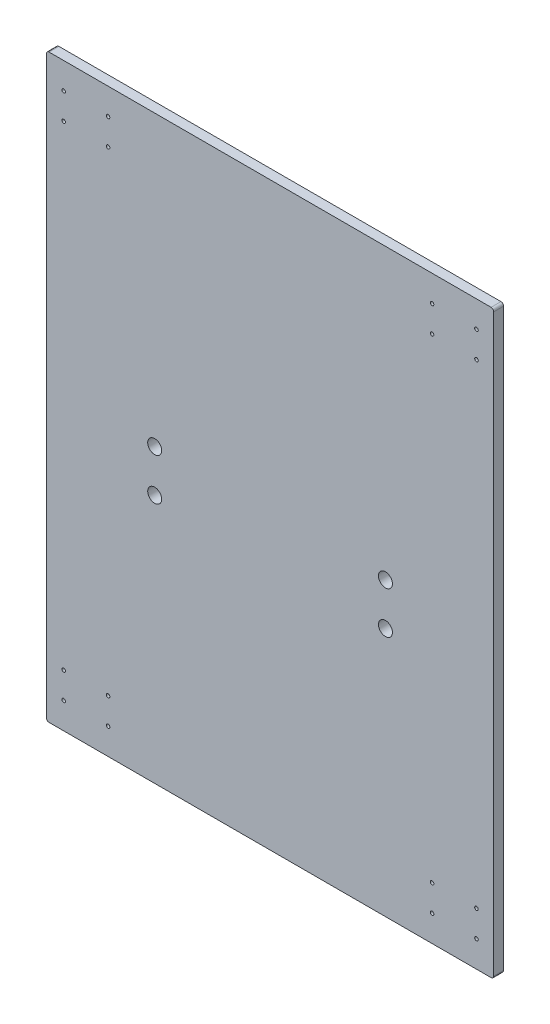
ISO-10303-21;
HEADER;
FILE_DESCRIPTION(('STEP AP214'),'2;1');
FILE_NAME('part.step','',(''),(''),'','','');
FILE_SCHEMA(('AUTOMOTIVE_DESIGN { 1 0 10303 214 1 1 1 1 }'));
ENDSEC;
DATA;
#1=APPLICATION_CONTEXT('core data for automotive mechanical design processes');
#2=APPLICATION_PROTOCOL_DEFINITION('international standard','automotive_design',2000,#1);
#3=PRODUCT_CONTEXT('',#1,'mechanical');
#4=PRODUCT('Part','Part','',(#3));
#5=PRODUCT_RELATED_PRODUCT_CATEGORY('part','',(#4));
#6=PRODUCT_DEFINITION_FORMATION('','',#4);
#7=PRODUCT_DEFINITION_CONTEXT('part definition',#1,'design');
#8=PRODUCT_DEFINITION('design','',#6,#7);
#9=PRODUCT_DEFINITION_SHAPE('','',#8);
#10=(LENGTH_UNIT() NAMED_UNIT(*) SI_UNIT(.MILLI.,.METRE.));
#11=(NAMED_UNIT(*) PLANE_ANGLE_UNIT() SI_UNIT($,.RADIAN.));
#12=(NAMED_UNIT(*) SI_UNIT($,.STERADIAN.) SOLID_ANGLE_UNIT());
#13=UNCERTAINTY_MEASURE_WITH_UNIT(LENGTH_MEASURE(1.E-05),#10,'distance_accuracy_value','');
#14=(GEOMETRIC_REPRESENTATION_CONTEXT(3) GLOBAL_UNCERTAINTY_ASSIGNED_CONTEXT((#13)) GLOBAL_UNIT_ASSIGNED_CONTEXT((#10,
#11,#12)) REPRESENTATION_CONTEXT('',''));
#15=CARTESIAN_POINT('',(0.,0.,0.));
#16=DIRECTION('',(0.,0.,1.));
#17=DIRECTION('',(1.,0.,0.));
#18=AXIS2_PLACEMENT_3D('',#15,#16,#17);
#19=CARTESIAN_POINT('',(0.,0.,0.));
#20=DIRECTION('',(0.,0.,1.));
#21=DIRECTION('',(1.,0.,0.));
#22=AXIS2_PLACEMENT_3D('',#19,#20,#21);
#23=PLANE('',#22);
#24=CARTESIAN_POINT('',(334.162399999999,-496.8875,0.));
#25=DIRECTION('',(0.,0.,-1.));
#26=DIRECTION('',(-1.,0.,0.));
#27=AXIS2_PLACEMENT_3D('',#24,#25,#26);
#28=CIRCLE('',#27,1.72719999999998);
#29=CARTESIAN_POINT('',(332.435199999999,-496.8875,0.));
#30=VERTEX_POINT('',#29);
#31=EDGE_CURVE('E217',#30,#30,#28,.T.);
#32=ORIENTED_EDGE('',*,*,#31,.F.);
#33=EDGE_LOOP('',(#32));
#34=FACE_BOUND('',#33,.T.);
#35=CARTESIAN_POINT('',(289.17138,-240.74374,0.));
#36=DIRECTION('',(0.,0.,-1.));
#37=DIRECTION('',(-1.,0.,0.));
#38=AXIS2_PLACEMENT_3D('',#35,#36,#37);
#39=CIRCLE('',#38,6.74624000000001);
#40=CARTESIAN_POINT('',(282.42514,-240.74374,0.));
#41=VERTEX_POINT('',#40);
#42=EDGE_CURVE('E199',#41,#41,#39,.T.);
#43=ORIENTED_EDGE('',*,*,#42,.F.);
#44=EDGE_LOOP('',(#43));
#45=FACE_BOUND('',#44,.T.);
#46=CARTESIAN_POINT('',(289.17138,-281.38374,0.));
#47=DIRECTION('',(0.,0.,-1.));
#48=DIRECTION('',(-1.,0.,0.));
#49=AXIS2_PLACEMENT_3D('',#46,#47,#48);
#50=CIRCLE('',#49,6.74624000000001);
#51=CARTESIAN_POINT('',(282.42514,-281.38374,0.));
#52=VERTEX_POINT('',#51);
#53=EDGE_CURVE('E193',#52,#52,#50,.T.);
#54=ORIENTED_EDGE('',*,*,#53,.F.);
#55=EDGE_LOOP('',(#54));
#56=FACE_BOUND('',#55,.T.);
#57=CARTESIAN_POINT('',(66.4286199999998,-240.74374,0.));
#58=DIRECTION('',(0.,0.,-1.));
#59=DIRECTION('',(-1.,0.,0.));
#60=AXIS2_PLACEMENT_3D('',#57,#58,#59);
#61=CIRCLE('',#60,6.74624);
#62=CARTESIAN_POINT('',(59.6823799999998,-240.74374,0.));
#63=VERTEX_POINT('',#62);
#64=EDGE_CURVE('E174',#63,#63,#61,.T.);
#65=ORIENTED_EDGE('',*,*,#64,.F.);
#66=EDGE_LOOP('',(#65));
#67=FACE_BOUND('',#66,.T.);
#68=DIRECTION('',(-1.,0.,0.));
#69=VECTOR('',#68,1.);
#70=CARTESIAN_POINT('',(393.699999999999,38.1,0.));
#71=LINE('',#70,#69);
#72=CARTESIAN_POINT('',(391.159999999999,38.1,0.));
#73=VERTEX_POINT('',#72);
#74=CARTESIAN_POINT('',(-35.56,38.1,0.));
#75=VERTEX_POINT('',#74);
#76=EDGE_CURVE('E124',#73,#75,#71,.T.);
#77=ORIENTED_EDGE('',*,*,#76,.F.);
#78=CARTESIAN_POINT('',(391.159999999999,35.56,0.));
#79=DIRECTION('',(0.,0.,1.));
#80=DIRECTION('',(1.,0.,0.));
#81=AXIS2_PLACEMENT_3D('',#78,#79,#80);
#82=CIRCLE('',#81,2.54);
#83=CARTESIAN_POINT('',(393.699999999999,35.56,0.));
#84=VERTEX_POINT('',#83);
#85=EDGE_CURVE('E107',#73,#84,#82,.F.);
#86=ORIENTED_EDGE('',*,*,#85,.T.);
#87=DIRECTION('',(0.,1.,0.));
#88=VECTOR('',#87,1.);
#89=CARTESIAN_POINT('',(393.699999999999,-522.2875,0.));
#90=LINE('',#89,#88);
#91=CARTESIAN_POINT('',(393.699999999999,-519.7475,0.));
#92=VERTEX_POINT('',#91);
#93=EDGE_CURVE('E134',#92,#84,#90,.T.);
#94=ORIENTED_EDGE('',*,*,#93,.F.);
#95=CARTESIAN_POINT('',(391.159999999999,-519.7475,0.));
#96=DIRECTION('',(0.,0.,1.));
#97=DIRECTION('',(1.,0.,0.));
#98=AXIS2_PLACEMENT_3D('',#95,#96,#97);
#99=CIRCLE('',#98,2.54);
#100=CARTESIAN_POINT('',(391.159999999999,-522.2875,0.));
#101=VERTEX_POINT('',#100);
#102=EDGE_CURVE('E118',#92,#101,#99,.F.);
#103=ORIENTED_EDGE('',*,*,#102,.T.);
#104=DIRECTION('',(1.,0.,0.));
#105=VECTOR('',#104,1.);
#106=CARTESIAN_POINT('',(393.699999999999,-522.2875,0.));
#107=LINE('',#106,#105);
#108=CARTESIAN_POINT('',(-35.56,-522.2875,0.));
#109=VERTEX_POINT('',#108);
#110=EDGE_CURVE('E138',#109,#101,#107,.T.);
#111=ORIENTED_EDGE('',*,*,#110,.F.);
#112=CARTESIAN_POINT('',(-35.56,-519.7475,0.));
#113=DIRECTION('',(0.,0.,1.));
#114=DIRECTION('',(1.,0.,0.));
#115=AXIS2_PLACEMENT_3D('',#112,#113,#114);
#116=CIRCLE('',#115,2.54);
#117=CARTESIAN_POINT('',(-38.1,-519.7475,0.));
#118=VERTEX_POINT('',#117);
#119=EDGE_CURVE('E144',#109,#118,#116,.F.);
#120=ORIENTED_EDGE('',*,*,#119,.T.);
#121=DIRECTION('',(0.,-1.,0.));
#122=VECTOR('',#121,1.);
#123=CARTESIAN_POINT('',(-38.1,-522.2875,0.));
#124=LINE('',#123,#122);
#125=CARTESIAN_POINT('',(-38.1,35.5599999999999,0.));
#126=VERTEX_POINT('',#125);
#127=EDGE_CURVE('E166',#126,#118,#124,.T.);
#128=ORIENTED_EDGE('',*,*,#127,.F.);
#129=CARTESIAN_POINT('',(-35.56,35.5599999999999,0.));
#130=DIRECTION('',(0.,0.,1.));
#131=DIRECTION('',(1.,0.,0.));
#132=AXIS2_PLACEMENT_3D('',#129,#130,#131);
#133=CIRCLE('',#132,2.54);
#134=EDGE_CURVE('E128',#126,#75,#133,.F.);
#135=ORIENTED_EDGE('',*,*,#134,.T.);
#136=EDGE_LOOP('',(#77,#86,#94,#103,#111,#120,#128,#135));
#137=FACE_BOUND('',#136,.T.);
#138=CARTESIAN_POINT('',(66.4286199999997,-281.38374,0.));
#139=DIRECTION('',(0.,0.,-1.));
#140=DIRECTION('',(-1.,0.,0.));
#141=AXIS2_PLACEMENT_3D('',#138,#139,#140);
#142=CIRCLE('',#141,6.74624);
#143=CARTESIAN_POINT('',(59.6823799999997,-281.38374,0.));
#144=VERTEX_POINT('',#143);
#145=EDGE_CURVE('E187',#144,#144,#142,.T.);
#146=ORIENTED_EDGE('',*,*,#145,.F.);
#147=EDGE_LOOP('',(#146));
#148=FACE_BOUND('',#147,.T.);
#149=CARTESIAN_POINT('',(377.037599999999,-496.8875,0.));
#150=DIRECTION('',(0.,0.,-1.));
#151=DIRECTION('',(-1.,0.,0.));
#152=AXIS2_PLACEMENT_3D('',#149,#150,#151);
#153=CIRCLE('',#152,1.72719999999998);
#154=CARTESIAN_POINT('',(375.310399999999,-496.8875,0.));
#155=VERTEX_POINT('',#154);
#156=EDGE_CURVE('E205',#155,#155,#153,.T.);
#157=ORIENTED_EDGE('',*,*,#156,.F.);
#158=EDGE_LOOP('',(#157));
#159=FACE_BOUND('',#158,.T.);
#160=CARTESIAN_POINT('',(377.037599999999,-471.4875,0.));
#161=DIRECTION('',(0.,0.,-1.));
#162=DIRECTION('',(-1.,0.,0.));
#163=AXIS2_PLACEMENT_3D('',#160,#161,#162);
#164=CIRCLE('',#163,1.72719999999998);
#165=CARTESIAN_POINT('',(375.310399999999,-471.4875,0.));
#166=VERTEX_POINT('',#165);
#167=EDGE_CURVE('E211',#166,#166,#164,.T.);
#168=ORIENTED_EDGE('',*,*,#167,.F.);
#169=EDGE_LOOP('',(#168));
#170=FACE_BOUND('',#169,.T.);
#171=CARTESIAN_POINT('',(334.162399999999,-471.4875,0.));
#172=DIRECTION('',(0.,0.,-1.));
#173=DIRECTION('',(-1.,0.,0.));
#174=AXIS2_PLACEMENT_3D('',#171,#172,#173);
#175=CIRCLE('',#174,1.72719999999998);
#176=CARTESIAN_POINT('',(332.435199999999,-471.4875,0.));
#177=VERTEX_POINT('',#176);
#178=EDGE_CURVE('E223',#177,#177,#175,.T.);
#179=ORIENTED_EDGE('',*,*,#178,.F.);
#180=EDGE_LOOP('',(#179));
#181=FACE_BOUND('',#180,.T.);
#182=CARTESIAN_POINT('',(21.4376000000001,-471.4875,0.));
#183=DIRECTION('',(0.,0.,-1.));
#184=DIRECTION('',(-1.,0.,0.));
#185=AXIS2_PLACEMENT_3D('',#182,#183,#184);
#186=CIRCLE('',#185,1.7272);
#187=CARTESIAN_POINT('',(19.7104000000001,-471.4875,0.));
#188=VERTEX_POINT('',#187);
#189=EDGE_CURVE('E229',#188,#188,#186,.T.);
#190=ORIENTED_EDGE('',*,*,#189,.F.);
#191=EDGE_LOOP('',(#190));
#192=FACE_BOUND('',#191,.T.);
#193=CARTESIAN_POINT('',(-21.4375999999999,-471.4875,0.));
#194=DIRECTION('',(0.,0.,-1.));
#195=DIRECTION('',(-1.,0.,0.));
#196=AXIS2_PLACEMENT_3D('',#193,#194,#195);
#197=CIRCLE('',#196,1.7272);
#198=CARTESIAN_POINT('',(-23.1647999999999,-471.4875,0.));
#199=VERTEX_POINT('',#198);
#200=EDGE_CURVE('E235',#199,#199,#197,.T.);
#201=ORIENTED_EDGE('',*,*,#200,.F.);
#202=EDGE_LOOP('',(#201));
#203=FACE_BOUND('',#202,.T.);
#204=CARTESIAN_POINT('',(-21.4376,-496.8875,0.));
#205=DIRECTION('',(0.,0.,-1.));
#206=DIRECTION('',(-1.,0.,0.));
#207=AXIS2_PLACEMENT_3D('',#204,#205,#206);
#208=CIRCLE('',#207,1.7272);
#209=CARTESIAN_POINT('',(-23.1647999999999,-496.8875,0.));
#210=VERTEX_POINT('',#209);
#211=EDGE_CURVE('E241',#210,#210,#208,.T.);
#212=ORIENTED_EDGE('',*,*,#211,.F.);
#213=EDGE_LOOP('',(#212));
#214=FACE_BOUND('',#213,.T.);
#215=CARTESIAN_POINT('',(21.4376,-496.8875,0.));
#216=DIRECTION('',(0.,0.,-1.));
#217=DIRECTION('',(-1.,0.,0.));
#218=AXIS2_PLACEMENT_3D('',#215,#216,#217);
#219=CIRCLE('',#218,1.7272);
#220=CARTESIAN_POINT('',(19.7104000000001,-496.8875,0.));
#221=VERTEX_POINT('',#220);
#222=EDGE_CURVE('E247',#221,#221,#219,.T.);
#223=ORIENTED_EDGE('',*,*,#222,.F.);
#224=EDGE_LOOP('',(#223));
#225=FACE_BOUND('',#224,.T.);
#226=CARTESIAN_POINT('',(21.4376000000001,12.7,0.));
#227=DIRECTION('',(0.,0.,-1.));
#228=DIRECTION('',(-1.,0.,0.));
#229=AXIS2_PLACEMENT_3D('',#226,#227,#228);
#230=CIRCLE('',#229,1.7272);
#231=CARTESIAN_POINT('',(19.7104000000001,12.7,0.));
#232=VERTEX_POINT('',#231);
#233=EDGE_CURVE('E253',#232,#232,#230,.T.);
#234=ORIENTED_EDGE('',*,*,#233,.F.);
#235=EDGE_LOOP('',(#234));
#236=FACE_BOUND('',#235,.T.);
#237=CARTESIAN_POINT('',(-21.4375999999999,12.7,0.));
#238=DIRECTION('',(0.,0.,-1.));
#239=DIRECTION('',(-1.,0.,0.));
#240=AXIS2_PLACEMENT_3D('',#237,#238,#239);
#241=CIRCLE('',#240,1.7272);
#242=CARTESIAN_POINT('',(-23.1647999999999,12.7,0.));
#243=VERTEX_POINT('',#242);
#244=EDGE_CURVE('E259',#243,#243,#241,.T.);
#245=ORIENTED_EDGE('',*,*,#244,.F.);
#246=EDGE_LOOP('',(#245));
#247=FACE_BOUND('',#246,.T.);
#248=CARTESIAN_POINT('',(-21.4375999999999,-12.7,0.));
#249=DIRECTION('',(0.,0.,-1.));
#250=DIRECTION('',(-1.,0.,0.));
#251=AXIS2_PLACEMENT_3D('',#248,#249,#250);
#252=CIRCLE('',#251,1.7272);
#253=CARTESIAN_POINT('',(-23.1647999999999,-12.7,0.));
#254=VERTEX_POINT('',#253);
#255=EDGE_CURVE('E265',#254,#254,#252,.T.);
#256=ORIENTED_EDGE('',*,*,#255,.F.);
#257=EDGE_LOOP('',(#256));
#258=FACE_BOUND('',#257,.T.);
#259=CARTESIAN_POINT('',(21.4376000000001,-12.7,0.));
#260=DIRECTION('',(0.,0.,-1.));
#261=DIRECTION('',(-1.,0.,0.));
#262=AXIS2_PLACEMENT_3D('',#259,#260,#261);
#263=CIRCLE('',#262,1.7272);
#264=CARTESIAN_POINT('',(19.7104000000001,-12.7,0.));
#265=VERTEX_POINT('',#264);
#266=EDGE_CURVE('E271',#265,#265,#263,.T.);
#267=ORIENTED_EDGE('',*,*,#266,.F.);
#268=EDGE_LOOP('',(#267));
#269=FACE_BOUND('',#268,.T.);
#270=CARTESIAN_POINT('',(334.162399999999,-12.7,0.));
#271=DIRECTION('',(0.,0.,-1.));
#272=DIRECTION('',(-1.,0.,0.));
#273=AXIS2_PLACEMENT_3D('',#270,#271,#272);
#274=CIRCLE('',#273,1.72719999999998);
#275=CARTESIAN_POINT('',(332.435199999999,-12.7,0.));
#276=VERTEX_POINT('',#275);
#277=EDGE_CURVE('E277',#276,#276,#274,.T.);
#278=ORIENTED_EDGE('',*,*,#277,.F.);
#279=EDGE_LOOP('',(#278));
#280=FACE_BOUND('',#279,.T.);
#281=CARTESIAN_POINT('',(334.162399999999,12.7,0.));
#282=DIRECTION('',(0.,0.,-1.));
#283=DIRECTION('',(-1.,0.,0.));
#284=AXIS2_PLACEMENT_3D('',#281,#282,#283);
#285=CIRCLE('',#284,1.72719999999998);
#286=CARTESIAN_POINT('',(332.435199999999,12.7,0.));
#287=VERTEX_POINT('',#286);
#288=EDGE_CURVE('E283',#287,#287,#285,.T.);
#289=ORIENTED_EDGE('',*,*,#288,.F.);
#290=EDGE_LOOP('',(#289));
#291=FACE_BOUND('',#290,.T.);
#292=CARTESIAN_POINT('',(377.037599999999,-12.7,0.));
#293=DIRECTION('',(0.,0.,-1.));
#294=DIRECTION('',(-1.,0.,0.));
#295=AXIS2_PLACEMENT_3D('',#292,#293,#294);
#296=CIRCLE('',#295,1.72719999999998);
#297=CARTESIAN_POINT('',(375.310399999999,-12.7,0.));
#298=VERTEX_POINT('',#297);
#299=EDGE_CURVE('E289',#298,#298,#296,.T.);
#300=ORIENTED_EDGE('',*,*,#299,.F.);
#301=EDGE_LOOP('',(#300));
#302=FACE_BOUND('',#301,.T.);
#303=CARTESIAN_POINT('',(377.037599999999,12.7,0.));
#304=DIRECTION('',(0.,0.,-1.));
#305=DIRECTION('',(-1.,0.,0.));
#306=AXIS2_PLACEMENT_3D('',#303,#304,#305);
#307=CIRCLE('',#306,1.72719999999998);
#308=CARTESIAN_POINT('',(375.310399999999,12.7,0.));
#309=VERTEX_POINT('',#308);
#310=EDGE_CURVE('E295',#309,#309,#307,.T.);
#311=ORIENTED_EDGE('',*,*,#310,.F.);
#312=EDGE_LOOP('',(#311));
#313=FACE_BOUND('',#312,.T.);
#314=ADVANCED_FACE('F41',(#34,#45,#56,#67,#137,#148,#159,#170,#181,#192,#203,#214,#225,#236,
#247,#258,#269,#280,#291,#302,#313),#23,.F.);
#315=CARTESIAN_POINT('',(-38.1,-522.2875,9.525));
#316=DIRECTION('',(1.,0.,0.));
#317=DIRECTION('',(0.,0.,-1.));
#318=AXIS2_PLACEMENT_3D('',#315,#316,#317);
#319=PLANE('',#318);
#320=ORIENTED_EDGE('',*,*,#127,.T.);
#321=DIRECTION('',(0.,0.,-1.));
#322=VECTOR('',#321,1.);
#323=CARTESIAN_POINT('',(-38.1,-519.7475,9.525));
#324=LINE('',#323,#322);
#325=CARTESIAN_POINT('',(-38.1,-519.7475,9.525));
#326=VERTEX_POINT('',#325);
#327=EDGE_CURVE('E11',#118,#326,#324,.F.);
#328=ORIENTED_EDGE('',*,*,#327,.T.);
#329=DIRECTION('',(0.,-1.,0.));
#330=VECTOR('',#329,1.);
#331=CARTESIAN_POINT('',(-38.1,-522.2875,9.525));
#332=LINE('',#331,#330);
#333=CARTESIAN_POINT('',(-38.1,35.5599999999999,9.525));
#334=VERTEX_POINT('',#333);
#335=EDGE_CURVE('E133',#334,#326,#332,.T.);
#336=ORIENTED_EDGE('',*,*,#335,.F.);
#337=DIRECTION('',(0.,0.,-1.));
#338=VECTOR('',#337,1.);
#339=CARTESIAN_POINT('',(-38.1,35.5599999999999,9.525));
#340=LINE('',#339,#338);
#341=EDGE_CURVE('E49',#334,#126,#340,.T.);
#342=ORIENTED_EDGE('',*,*,#341,.T.);
#343=EDGE_LOOP('',(#320,#328,#336,#342));
#344=FACE_BOUND('',#343,.T.);
#345=ADVANCED_FACE('F165',(#344),#319,.F.);
#346=CARTESIAN_POINT('',(393.699999999999,-522.2875,9.525));
#347=DIRECTION('',(0.,1.,0.));
#348=DIRECTION('',(0.,0.,1.));
#349=AXIS2_PLACEMENT_3D('',#346,#347,#348);
#350=PLANE('',#349);
#351=ORIENTED_EDGE('',*,*,#110,.T.);
#352=DIRECTION('',(0.,0.,-1.));
#353=VECTOR('',#352,1.);
#354=CARTESIAN_POINT('',(391.159999999999,-522.2875,9.525));
#355=LINE('',#354,#353);
#356=CARTESIAN_POINT('',(391.159999999999,-522.2875,9.525));
#357=VERTEX_POINT('',#356);
#358=EDGE_CURVE('E56',#101,#357,#355,.F.);
#359=ORIENTED_EDGE('',*,*,#358,.T.);
#360=DIRECTION('',(1.,0.,0.));
#361=VECTOR('',#360,1.);
#362=CARTESIAN_POINT('',(393.699999999999,-522.2875,9.525));
#363=LINE('',#362,#361);
#364=CARTESIAN_POINT('',(-35.56,-522.2875,9.525));
#365=VERTEX_POINT('',#364);
#366=EDGE_CURVE('E136',#365,#357,#363,.T.);
#367=ORIENTED_EDGE('',*,*,#366,.F.);
#368=DIRECTION('',(0.,0.,-1.));
#369=VECTOR('',#368,1.);
#370=CARTESIAN_POINT('',(-35.56,-522.2875,9.525));
#371=LINE('',#370,#369);
#372=EDGE_CURVE('E157',#365,#109,#371,.T.);
#373=ORIENTED_EDGE('',*,*,#372,.T.);
#374=EDGE_LOOP('',(#351,#359,#367,#373));
#375=FACE_BOUND('',#374,.T.);
#376=ADVANCED_FACE('F310',(#375),#350,.F.);
#377=CARTESIAN_POINT('',(393.699999999999,-522.2875,9.525));
#378=DIRECTION('',(-1.,0.,0.));
#379=DIRECTION('',(0.,0.,1.));
#380=AXIS2_PLACEMENT_3D('',#377,#378,#379);
#381=PLANE('',#380);
#382=ORIENTED_EDGE('',*,*,#93,.T.);
#383=DIRECTION('',(0.,0.,-1.));
#384=VECTOR('',#383,1.);
#385=CARTESIAN_POINT('',(393.699999999999,35.56,9.525));
#386=LINE('',#385,#384);
#387=CARTESIAN_POINT('',(393.699999999999,35.56,9.525));
#388=VERTEX_POINT('',#387);
#389=EDGE_CURVE('E112',#84,#388,#386,.F.);
#390=ORIENTED_EDGE('',*,*,#389,.T.);
#391=DIRECTION('',(0.,1.,0.));
#392=VECTOR('',#391,1.);
#393=CARTESIAN_POINT('',(393.699999999999,-522.2875,9.525));
#394=LINE('',#393,#392);
#395=CARTESIAN_POINT('',(393.699999999999,-519.7475,9.525));
#396=VERTEX_POINT('',#395);
#397=EDGE_CURVE('E178',#396,#388,#394,.T.);
#398=ORIENTED_EDGE('',*,*,#397,.F.);
#399=DIRECTION('',(0.,0.,-1.));
#400=VECTOR('',#399,1.);
#401=CARTESIAN_POINT('',(393.699999999999,-519.7475,9.525));
#402=LINE('',#401,#400);
#403=EDGE_CURVE('E117',#396,#92,#402,.T.);
#404=ORIENTED_EDGE('',*,*,#403,.T.);
#405=EDGE_LOOP('',(#382,#390,#398,#404));
#406=FACE_BOUND('',#405,.T.);
#407=ADVANCED_FACE('F320',(#406),#381,.F.);
#408=CARTESIAN_POINT('',(393.699999999999,38.1,9.525));
#409=DIRECTION('',(0.,-1.,0.));
#410=DIRECTION('',(0.,0.,-1.));
#411=AXIS2_PLACEMENT_3D('',#408,#409,#410);
#412=PLANE('',#411);
#413=DIRECTION('',(-1.,0.,0.));
#414=VECTOR('',#413,1.);
#415=CARTESIAN_POINT('',(393.699999999999,38.1,9.525));
#416=LINE('',#415,#414);
#417=CARTESIAN_POINT('',(391.159999999999,38.1,9.525));
#418=VERTEX_POINT('',#417);
#419=CARTESIAN_POINT('',(-35.56,38.1,9.525));
#420=VERTEX_POINT('',#419);
#421=EDGE_CURVE('E127',#418,#420,#416,.T.);
#422=ORIENTED_EDGE('',*,*,#421,.F.);
#423=DIRECTION('',(0.,0.,-1.));
#424=VECTOR('',#423,1.);
#425=CARTESIAN_POINT('',(391.159999999999,38.1,9.525));
#426=LINE('',#425,#424);
#427=EDGE_CURVE('E111',#418,#73,#426,.T.);
#428=ORIENTED_EDGE('',*,*,#427,.T.);
#429=ORIENTED_EDGE('',*,*,#76,.T.);
#430=DIRECTION('',(0.,0.,-1.));
#431=VECTOR('',#430,1.);
#432=CARTESIAN_POINT('',(-35.56,38.1,9.525));
#433=LINE('',#432,#431);
#434=EDGE_CURVE('E129',#75,#420,#433,.F.);
#435=ORIENTED_EDGE('',*,*,#434,.T.);
#436=EDGE_LOOP('',(#422,#428,#429,#435));
#437=FACE_BOUND('',#436,.T.);
#438=ADVANCED_FACE('F123',(#437),#412,.F.);
#439=CARTESIAN_POINT('',(0.,0.,9.525));
#440=DIRECTION('',(0.,0.,1.));
#441=DIRECTION('',(1.,0.,0.));
#442=AXIS2_PLACEMENT_3D('',#439,#440,#441);
#443=PLANE('',#442);
#444=CARTESIAN_POINT('',(377.037599999999,12.7,9.525));
#445=DIRECTION('',(0.,0.,1.));
#446=DIRECTION('',(1.,0.,0.));
#447=AXIS2_PLACEMENT_3D('',#444,#445,#446);
#448=CIRCLE('',#447,1.72719999999998);
#449=CARTESIAN_POINT('',(378.764799999999,12.7,9.525));
#450=VERTEX_POINT('',#449);
#451=EDGE_CURVE('E292',#450,#450,#448,.T.);
#452=ORIENTED_EDGE('',*,*,#451,.F.);
#453=EDGE_LOOP('',(#452));
#454=FACE_BOUND('',#453,.T.);
#455=CARTESIAN_POINT('',(377.037599999999,-12.7,9.525));
#456=DIRECTION('',(0.,0.,1.));
#457=DIRECTION('',(1.,0.,0.));
#458=AXIS2_PLACEMENT_3D('',#455,#456,#457);
#459=CIRCLE('',#458,1.72719999999998);
#460=CARTESIAN_POINT('',(378.764799999999,-12.7,9.525));
#461=VERTEX_POINT('',#460);
#462=EDGE_CURVE('E286',#461,#461,#459,.T.);
#463=ORIENTED_EDGE('',*,*,#462,.F.);
#464=EDGE_LOOP('',(#463));
#465=FACE_BOUND('',#464,.T.);
#466=CARTESIAN_POINT('',(334.162399999999,12.7,9.525));
#467=DIRECTION('',(0.,0.,1.));
#468=DIRECTION('',(1.,0.,0.));
#469=AXIS2_PLACEMENT_3D('',#466,#467,#468);
#470=CIRCLE('',#469,1.72719999999998);
#471=CARTESIAN_POINT('',(335.889599999999,12.7,9.525));
#472=VERTEX_POINT('',#471);
#473=EDGE_CURVE('E280',#472,#472,#470,.T.);
#474=ORIENTED_EDGE('',*,*,#473,.F.);
#475=EDGE_LOOP('',(#474));
#476=FACE_BOUND('',#475,.T.);
#477=CARTESIAN_POINT('',(334.162399999999,-12.7,9.525));
#478=DIRECTION('',(0.,0.,1.));
#479=DIRECTION('',(1.,0.,0.));
#480=AXIS2_PLACEMENT_3D('',#477,#478,#479);
#481=CIRCLE('',#480,1.72719999999998);
#482=CARTESIAN_POINT('',(335.889599999999,-12.7,9.525));
#483=VERTEX_POINT('',#482);
#484=EDGE_CURVE('E274',#483,#483,#481,.T.);
#485=ORIENTED_EDGE('',*,*,#484,.F.);
#486=EDGE_LOOP('',(#485));
#487=FACE_BOUND('',#486,.T.);
#488=CARTESIAN_POINT('',(21.4376000000001,-12.7,9.525));
#489=DIRECTION('',(0.,0.,1.));
#490=DIRECTION('',(1.,0.,0.));
#491=AXIS2_PLACEMENT_3D('',#488,#489,#490);
#492=CIRCLE('',#491,1.7272);
#493=CARTESIAN_POINT('',(23.1648000000001,-12.7,9.525));
#494=VERTEX_POINT('',#493);
#495=EDGE_CURVE('E268',#494,#494,#492,.T.);
#496=ORIENTED_EDGE('',*,*,#495,.F.);
#497=EDGE_LOOP('',(#496));
#498=FACE_BOUND('',#497,.T.);
#499=CARTESIAN_POINT('',(-21.4375999999999,-12.7,9.525));
#500=DIRECTION('',(0.,0.,1.));
#501=DIRECTION('',(1.,0.,0.));
#502=AXIS2_PLACEMENT_3D('',#499,#500,#501);
#503=CIRCLE('',#502,1.7272);
#504=CARTESIAN_POINT('',(-19.7103999999999,-12.7,9.525));
#505=VERTEX_POINT('',#504);
#506=EDGE_CURVE('E262',#505,#505,#503,.T.);
#507=ORIENTED_EDGE('',*,*,#506,.F.);
#508=EDGE_LOOP('',(#507));
#509=FACE_BOUND('',#508,.T.);
#510=CARTESIAN_POINT('',(-21.4375999999999,12.7,9.525));
#511=DIRECTION('',(0.,0.,1.));
#512=DIRECTION('',(1.,0.,0.));
#513=AXIS2_PLACEMENT_3D('',#510,#511,#512);
#514=CIRCLE('',#513,1.7272);
#515=CARTESIAN_POINT('',(-19.7103999999999,12.7,9.525));
#516=VERTEX_POINT('',#515);
#517=EDGE_CURVE('E256',#516,#516,#514,.T.);
#518=ORIENTED_EDGE('',*,*,#517,.F.);
#519=EDGE_LOOP('',(#518));
#520=FACE_BOUND('',#519,.T.);
#521=CARTESIAN_POINT('',(21.4376000000001,12.7,9.525));
#522=DIRECTION('',(0.,0.,1.));
#523=DIRECTION('',(1.,0.,0.));
#524=AXIS2_PLACEMENT_3D('',#521,#522,#523);
#525=CIRCLE('',#524,1.7272);
#526=CARTESIAN_POINT('',(23.1648000000001,12.7,9.525));
#527=VERTEX_POINT('',#526);
#528=EDGE_CURVE('E250',#527,#527,#525,.T.);
#529=ORIENTED_EDGE('',*,*,#528,.F.);
#530=EDGE_LOOP('',(#529));
#531=FACE_BOUND('',#530,.T.);
#532=CARTESIAN_POINT('',(21.4376,-496.8875,9.525));
#533=DIRECTION('',(0.,0.,1.));
#534=DIRECTION('',(1.,0.,0.));
#535=AXIS2_PLACEMENT_3D('',#532,#533,#534);
#536=CIRCLE('',#535,1.7272);
#537=CARTESIAN_POINT('',(23.1648,-496.8875,9.525));
#538=VERTEX_POINT('',#537);
#539=EDGE_CURVE('E244',#538,#538,#536,.T.);
#540=ORIENTED_EDGE('',*,*,#539,.F.);
#541=EDGE_LOOP('',(#540));
#542=FACE_BOUND('',#541,.T.);
#543=CARTESIAN_POINT('',(-21.4376,-496.8875,9.525));
#544=DIRECTION('',(0.,0.,1.));
#545=DIRECTION('',(1.,0.,0.));
#546=AXIS2_PLACEMENT_3D('',#543,#544,#545);
#547=CIRCLE('',#546,1.7272);
#548=CARTESIAN_POINT('',(-19.7104,-496.8875,9.525));
#549=VERTEX_POINT('',#548);
#550=EDGE_CURVE('E238',#549,#549,#547,.T.);
#551=ORIENTED_EDGE('',*,*,#550,.F.);
#552=EDGE_LOOP('',(#551));
#553=FACE_BOUND('',#552,.T.);
#554=CARTESIAN_POINT('',(-21.4375999999999,-471.4875,9.525));
#555=DIRECTION('',(0.,0.,1.));
#556=DIRECTION('',(1.,0.,0.));
#557=AXIS2_PLACEMENT_3D('',#554,#555,#556);
#558=CIRCLE('',#557,1.7272);
#559=CARTESIAN_POINT('',(-19.7103999999999,-471.4875,9.525));
#560=VERTEX_POINT('',#559);
#561=EDGE_CURVE('E232',#560,#560,#558,.T.);
#562=ORIENTED_EDGE('',*,*,#561,.F.);
#563=EDGE_LOOP('',(#562));
#564=FACE_BOUND('',#563,.T.);
#565=CARTESIAN_POINT('',(21.4376000000001,-471.4875,9.525));
#566=DIRECTION('',(0.,0.,1.));
#567=DIRECTION('',(1.,0.,0.));
#568=AXIS2_PLACEMENT_3D('',#565,#566,#567);
#569=CIRCLE('',#568,1.7272);
#570=CARTESIAN_POINT('',(23.1648000000001,-471.4875,9.525));
#571=VERTEX_POINT('',#570);
#572=EDGE_CURVE('E226',#571,#571,#569,.T.);
#573=ORIENTED_EDGE('',*,*,#572,.F.);
#574=EDGE_LOOP('',(#573));
#575=FACE_BOUND('',#574,.T.);
#576=CARTESIAN_POINT('',(334.162399999999,-471.4875,9.525));
#577=DIRECTION('',(0.,0.,1.));
#578=DIRECTION('',(1.,0.,0.));
#579=AXIS2_PLACEMENT_3D('',#576,#577,#578);
#580=CIRCLE('',#579,1.72719999999998);
#581=CARTESIAN_POINT('',(335.889599999999,-471.4875,9.525));
#582=VERTEX_POINT('',#581);
#583=EDGE_CURVE('E220',#582,#582,#580,.T.);
#584=ORIENTED_EDGE('',*,*,#583,.F.);
#585=EDGE_LOOP('',(#584));
#586=FACE_BOUND('',#585,.T.);
#587=CARTESIAN_POINT('',(334.162399999999,-496.8875,9.525));
#588=DIRECTION('',(0.,0.,1.));
#589=DIRECTION('',(1.,0.,0.));
#590=AXIS2_PLACEMENT_3D('',#587,#588,#589);
#591=CIRCLE('',#590,1.72719999999998);
#592=CARTESIAN_POINT('',(335.889599999999,-496.8875,9.525));
#593=VERTEX_POINT('',#592);
#594=EDGE_CURVE('E214',#593,#593,#591,.T.);
#595=ORIENTED_EDGE('',*,*,#594,.F.);
#596=EDGE_LOOP('',(#595));
#597=FACE_BOUND('',#596,.T.);
#598=CARTESIAN_POINT('',(377.037599999999,-471.4875,9.525));
#599=DIRECTION('',(0.,0.,1.));
#600=DIRECTION('',(1.,0.,0.));
#601=AXIS2_PLACEMENT_3D('',#598,#599,#600);
#602=CIRCLE('',#601,1.72719999999998);
#603=CARTESIAN_POINT('',(378.764799999999,-471.4875,9.525));
#604=VERTEX_POINT('',#603);
#605=EDGE_CURVE('E208',#604,#604,#602,.T.);
#606=ORIENTED_EDGE('',*,*,#605,.F.);
#607=EDGE_LOOP('',(#606));
#608=FACE_BOUND('',#607,.T.);
#609=CARTESIAN_POINT('',(377.037599999999,-496.8875,9.525));
#610=DIRECTION('',(0.,0.,1.));
#611=DIRECTION('',(1.,0.,0.));
#612=AXIS2_PLACEMENT_3D('',#609,#610,#611);
#613=CIRCLE('',#612,1.72719999999998);
#614=CARTESIAN_POINT('',(378.764799999999,-496.8875,9.525));
#615=VERTEX_POINT('',#614);
#616=EDGE_CURVE('E202',#615,#615,#613,.T.);
#617=ORIENTED_EDGE('',*,*,#616,.F.);
#618=EDGE_LOOP('',(#617));
#619=FACE_BOUND('',#618,.T.);
#620=CARTESIAN_POINT('',(289.17138,-240.74374,9.525));
#621=DIRECTION('',(0.,0.,1.));
#622=DIRECTION('',(1.,0.,0.));
#623=AXIS2_PLACEMENT_3D('',#620,#621,#622);
#624=CIRCLE('',#623,6.74624000000001);
#625=CARTESIAN_POINT('',(295.91762,-240.74374,9.525));
#626=VERTEX_POINT('',#625);
#627=EDGE_CURVE('E196',#626,#626,#624,.T.);
#628=ORIENTED_EDGE('',*,*,#627,.F.);
#629=EDGE_LOOP('',(#628));
#630=FACE_BOUND('',#629,.T.);
#631=CARTESIAN_POINT('',(289.17138,-281.38374,9.525));
#632=DIRECTION('',(0.,0.,1.));
#633=DIRECTION('',(1.,0.,0.));
#634=AXIS2_PLACEMENT_3D('',#631,#632,#633);
#635=CIRCLE('',#634,6.74624000000001);
#636=CARTESIAN_POINT('',(295.91762,-281.38374,9.525));
#637=VERTEX_POINT('',#636);
#638=EDGE_CURVE('E190',#637,#637,#635,.T.);
#639=ORIENTED_EDGE('',*,*,#638,.F.);
#640=EDGE_LOOP('',(#639));
#641=FACE_BOUND('',#640,.T.);
#642=CARTESIAN_POINT('',(66.4286199999997,-281.38374,9.525));
#643=DIRECTION('',(0.,0.,1.));
#644=DIRECTION('',(1.,0.,0.));
#645=AXIS2_PLACEMENT_3D('',#642,#643,#644);
#646=CIRCLE('',#645,6.74624);
#647=CARTESIAN_POINT('',(73.1748599999997,-281.38374,9.525));
#648=VERTEX_POINT('',#647);
#649=EDGE_CURVE('E184',#648,#648,#646,.T.);
#650=ORIENTED_EDGE('',*,*,#649,.F.);
#651=EDGE_LOOP('',(#650));
#652=FACE_BOUND('',#651,.T.);
#653=CARTESIAN_POINT('',(66.4286199999998,-240.74374,9.525));
#654=DIRECTION('',(0.,0.,1.));
#655=DIRECTION('',(1.,0.,0.));
#656=AXIS2_PLACEMENT_3D('',#653,#654,#655);
#657=CIRCLE('',#656,6.74624);
#658=CARTESIAN_POINT('',(73.1748599999998,-240.74374,9.525));
#659=VERTEX_POINT('',#658);
#660=EDGE_CURVE('E171',#659,#659,#657,.T.);
#661=ORIENTED_EDGE('',*,*,#660,.F.);
#662=EDGE_LOOP('',(#661));
#663=FACE_BOUND('',#662,.T.);
#664=ORIENTED_EDGE('',*,*,#397,.T.);
#665=CARTESIAN_POINT('',(391.159999999999,35.56,9.525));
#666=DIRECTION('',(0.,0.,1.));
#667=DIRECTION('',(1.,0.,0.));
#668=AXIS2_PLACEMENT_3D('',#665,#666,#667);
#669=CIRCLE('',#668,2.54);
#670=EDGE_CURVE('E155',#388,#418,#669,.T.);
#671=ORIENTED_EDGE('',*,*,#670,.T.);
#672=ORIENTED_EDGE('',*,*,#421,.T.);
#673=CARTESIAN_POINT('',(-35.56,35.5599999999999,9.525));
#674=DIRECTION('',(0.,0.,1.));
#675=DIRECTION('',(1.,0.,0.));
#676=AXIS2_PLACEMENT_3D('',#673,#674,#675);
#677=CIRCLE('',#676,2.54);
#678=EDGE_CURVE('E150',#420,#334,#677,.T.);
#679=ORIENTED_EDGE('',*,*,#678,.T.);
#680=ORIENTED_EDGE('',*,*,#335,.T.);
#681=CARTESIAN_POINT('',(-35.56,-519.7475,9.525));
#682=DIRECTION('',(0.,0.,1.));
#683=DIRECTION('',(1.,0.,0.));
#684=AXIS2_PLACEMENT_3D('',#681,#682,#683);
#685=CIRCLE('',#684,2.54);
#686=EDGE_CURVE('E63',#326,#365,#685,.T.);
#687=ORIENTED_EDGE('',*,*,#686,.T.);
#688=ORIENTED_EDGE('',*,*,#366,.T.);
#689=CARTESIAN_POINT('',(391.159999999999,-519.7475,9.525));
#690=DIRECTION('',(0.,0.,1.));
#691=DIRECTION('',(1.,0.,0.));
#692=AXIS2_PLACEMENT_3D('',#689,#690,#691);
#693=CIRCLE('',#692,2.54);
#694=EDGE_CURVE('E153',#357,#396,#693,.T.);
#695=ORIENTED_EDGE('',*,*,#694,.T.);
#696=EDGE_LOOP('',(#664,#671,#672,#679,#680,#687,#688,#695));
#697=FACE_BOUND('',#696,.T.);
#698=ADVANCED_FACE('F316',(#454,#465,#476,#487,#498,#509,#520,#531,#542,#553,#564,#575,#586,
#597,#608,#619,#630,#641,#652,#663,#697),#443,.T.);
#699=CARTESIAN_POINT('',(391.159999999999,35.56,9.525));
#700=DIRECTION('',(0.,0.,-1.));
#701=DIRECTION('',(-1.,0.,0.));
#702=AXIS2_PLACEMENT_3D('',#699,#700,#701);
#703=CYLINDRICAL_SURFACE('',#702,2.54);
#704=ORIENTED_EDGE('',*,*,#670,.F.);
#705=ORIENTED_EDGE('',*,*,#389,.F.);
#706=ORIENTED_EDGE('',*,*,#85,.F.);
#707=ORIENTED_EDGE('',*,*,#427,.F.);
#708=EDGE_LOOP('',(#704,#705,#706,#707));
#709=FACE_BOUND('',#708,.T.);
#710=ADVANCED_FACE('F110',(#709),#703,.T.);
#711=CARTESIAN_POINT('',(391.159999999999,-519.7475,9.525));
#712=DIRECTION('',(0.,0.,-1.));
#713=DIRECTION('',(-1.,0.,0.));
#714=AXIS2_PLACEMENT_3D('',#711,#712,#713);
#715=CYLINDRICAL_SURFACE('',#714,2.54);
#716=ORIENTED_EDGE('',*,*,#694,.F.);
#717=ORIENTED_EDGE('',*,*,#358,.F.);
#718=ORIENTED_EDGE('',*,*,#102,.F.);
#719=ORIENTED_EDGE('',*,*,#403,.F.);
#720=EDGE_LOOP('',(#716,#717,#718,#719));
#721=FACE_BOUND('',#720,.T.);
#722=ADVANCED_FACE('F328',(#721),#715,.T.);
#723=CARTESIAN_POINT('',(-35.56,-519.7475,9.525));
#724=DIRECTION('',(0.,0.,-1.));
#725=DIRECTION('',(-1.,0.,0.));
#726=AXIS2_PLACEMENT_3D('',#723,#724,#725);
#727=CYLINDRICAL_SURFACE('',#726,2.54);
#728=ORIENTED_EDGE('',*,*,#686,.F.);
#729=ORIENTED_EDGE('',*,*,#327,.F.);
#730=ORIENTED_EDGE('',*,*,#119,.F.);
#731=ORIENTED_EDGE('',*,*,#372,.F.);
#732=EDGE_LOOP('',(#728,#729,#730,#731));
#733=FACE_BOUND('',#732,.T.);
#734=ADVANCED_FACE('F330',(#733),#727,.T.);
#735=CARTESIAN_POINT('',(-35.56,35.5599999999999,9.525));
#736=DIRECTION('',(0.,0.,-1.));
#737=DIRECTION('',(-1.,0.,0.));
#738=AXIS2_PLACEMENT_3D('',#735,#736,#737);
#739=CYLINDRICAL_SURFACE('',#738,2.54);
#740=ORIENTED_EDGE('',*,*,#678,.F.);
#741=ORIENTED_EDGE('',*,*,#434,.F.);
#742=ORIENTED_EDGE('',*,*,#134,.F.);
#743=ORIENTED_EDGE('',*,*,#341,.F.);
#744=EDGE_LOOP('',(#740,#741,#742,#743));
#745=FACE_BOUND('',#744,.T.);
#746=ADVANCED_FACE('F43',(#745),#739,.T.);
#747=CARTESIAN_POINT('',(66.4286199999998,-240.74374,0.));
#748=DIRECTION('',(0.,0.,-1.));
#749=DIRECTION('',(-1.,0.,0.));
#750=AXIS2_PLACEMENT_3D('',#747,#748,#749);
#751=CYLINDRICAL_SURFACE('',#750,6.74624);
#752=ORIENTED_EDGE('',*,*,#64,.T.);
#753=EDGE_LOOP('',(#752));
#754=FACE_BOUND('',#753,.T.);
#755=ORIENTED_EDGE('',*,*,#660,.T.);
#756=EDGE_LOOP('',(#755));
#757=FACE_BOUND('',#756,.T.);
#758=ADVANCED_FACE('F337',(#754,#757),#751,.F.);
#759=CARTESIAN_POINT('',(66.4286199999997,-281.38374,0.));
#760=DIRECTION('',(0.,0.,-1.));
#761=DIRECTION('',(-1.,0.,0.));
#762=AXIS2_PLACEMENT_3D('',#759,#760,#761);
#763=CYLINDRICAL_SURFACE('',#762,6.74624);
#764=ORIENTED_EDGE('',*,*,#145,.T.);
#765=EDGE_LOOP('',(#764));
#766=FACE_BOUND('',#765,.T.);
#767=ORIENTED_EDGE('',*,*,#649,.T.);
#768=EDGE_LOOP('',(#767));
#769=FACE_BOUND('',#768,.T.);
#770=ADVANCED_FACE('F387',(#766,#769),#763,.F.);
#771=CARTESIAN_POINT('',(289.17138,-281.38374,0.));
#772=DIRECTION('',(0.,0.,-1.));
#773=DIRECTION('',(-1.,0.,0.));
#774=AXIS2_PLACEMENT_3D('',#771,#772,#773);
#775=CYLINDRICAL_SURFACE('',#774,6.74624000000001);
#776=ORIENTED_EDGE('',*,*,#53,.T.);
#777=EDGE_LOOP('',(#776));
#778=FACE_BOUND('',#777,.T.);
#779=ORIENTED_EDGE('',*,*,#638,.T.);
#780=EDGE_LOOP('',(#779));
#781=FACE_BOUND('',#780,.T.);
#782=ADVANCED_FACE('F392',(#778,#781),#775,.F.);
#783=CARTESIAN_POINT('',(289.17138,-240.74374,0.));
#784=DIRECTION('',(0.,0.,-1.));
#785=DIRECTION('',(-1.,0.,0.));
#786=AXIS2_PLACEMENT_3D('',#783,#784,#785);
#787=CYLINDRICAL_SURFACE('',#786,6.74624000000001);
#788=ORIENTED_EDGE('',*,*,#42,.T.);
#789=EDGE_LOOP('',(#788));
#790=FACE_BOUND('',#789,.T.);
#791=ORIENTED_EDGE('',*,*,#627,.T.);
#792=EDGE_LOOP('',(#791));
#793=FACE_BOUND('',#792,.T.);
#794=ADVANCED_FACE('F398',(#790,#793),#787,.F.);
#795=CARTESIAN_POINT('',(377.037599999999,-496.8875,0.));
#796=DIRECTION('',(0.,0.,-1.));
#797=DIRECTION('',(-1.,0.,0.));
#798=AXIS2_PLACEMENT_3D('',#795,#796,#797);
#799=CYLINDRICAL_SURFACE('',#798,1.72719999999998);
#800=ORIENTED_EDGE('',*,*,#156,.T.);
#801=EDGE_LOOP('',(#800));
#802=FACE_BOUND('',#801,.T.);
#803=ORIENTED_EDGE('',*,*,#616,.T.);
#804=EDGE_LOOP('',(#803));
#805=FACE_BOUND('',#804,.T.);
#806=ADVANCED_FACE('F401',(#802,#805),#799,.F.);
#807=CARTESIAN_POINT('',(377.037599999999,-471.4875,0.));
#808=DIRECTION('',(0.,0.,-1.));
#809=DIRECTION('',(-1.,0.,0.));
#810=AXIS2_PLACEMENT_3D('',#807,#808,#809);
#811=CYLINDRICAL_SURFACE('',#810,1.72719999999998);
#812=ORIENTED_EDGE('',*,*,#167,.T.);
#813=EDGE_LOOP('',(#812));
#814=FACE_BOUND('',#813,.T.);
#815=ORIENTED_EDGE('',*,*,#605,.T.);
#816=EDGE_LOOP('',(#815));
#817=FACE_BOUND('',#816,.T.);
#818=ADVANCED_FACE('F404',(#814,#817),#811,.F.);
#819=CARTESIAN_POINT('',(334.162399999999,-496.8875,0.));
#820=DIRECTION('',(0.,0.,-1.));
#821=DIRECTION('',(-1.,0.,0.));
#822=AXIS2_PLACEMENT_3D('',#819,#820,#821);
#823=CYLINDRICAL_SURFACE('',#822,1.72719999999998);
#824=ORIENTED_EDGE('',*,*,#31,.T.);
#825=EDGE_LOOP('',(#824));
#826=FACE_BOUND('',#825,.T.);
#827=ORIENTED_EDGE('',*,*,#594,.T.);
#828=EDGE_LOOP('',(#827));
#829=FACE_BOUND('',#828,.T.);
#830=ADVANCED_FACE('F408',(#826,#829),#823,.F.);
#831=CARTESIAN_POINT('',(334.162399999999,-471.4875,0.));
#832=DIRECTION('',(0.,0.,-1.));
#833=DIRECTION('',(-1.,0.,0.));
#834=AXIS2_PLACEMENT_3D('',#831,#832,#833);
#835=CYLINDRICAL_SURFACE('',#834,1.72719999999998);
#836=ORIENTED_EDGE('',*,*,#178,.T.);
#837=EDGE_LOOP('',(#836));
#838=FACE_BOUND('',#837,.T.);
#839=ORIENTED_EDGE('',*,*,#583,.T.);
#840=EDGE_LOOP('',(#839));
#841=FACE_BOUND('',#840,.T.);
#842=ADVANCED_FACE('F412',(#838,#841),#835,.F.);
#843=CARTESIAN_POINT('',(21.4376000000001,-471.4875,0.));
#844=DIRECTION('',(0.,0.,-1.));
#845=DIRECTION('',(-1.,0.,0.));
#846=AXIS2_PLACEMENT_3D('',#843,#844,#845);
#847=CYLINDRICAL_SURFACE('',#846,1.7272);
#848=ORIENTED_EDGE('',*,*,#189,.T.);
#849=EDGE_LOOP('',(#848));
#850=FACE_BOUND('',#849,.T.);
#851=ORIENTED_EDGE('',*,*,#572,.T.);
#852=EDGE_LOOP('',(#851));
#853=FACE_BOUND('',#852,.T.);
#854=ADVANCED_FACE('F416',(#850,#853),#847,.F.);
#855=CARTESIAN_POINT('',(-21.4375999999999,-471.4875,0.));
#856=DIRECTION('',(0.,0.,-1.));
#857=DIRECTION('',(-1.,0.,0.));
#858=AXIS2_PLACEMENT_3D('',#855,#856,#857);
#859=CYLINDRICAL_SURFACE('',#858,1.7272);
#860=ORIENTED_EDGE('',*,*,#200,.T.);
#861=EDGE_LOOP('',(#860));
#862=FACE_BOUND('',#861,.T.);
#863=ORIENTED_EDGE('',*,*,#561,.T.);
#864=EDGE_LOOP('',(#863));
#865=FACE_BOUND('',#864,.T.);
#866=ADVANCED_FACE('F420',(#862,#865),#859,.F.);
#867=CARTESIAN_POINT('',(-21.4376,-496.8875,0.));
#868=DIRECTION('',(0.,0.,-1.));
#869=DIRECTION('',(-1.,0.,0.));
#870=AXIS2_PLACEMENT_3D('',#867,#868,#869);
#871=CYLINDRICAL_SURFACE('',#870,1.7272);
#872=ORIENTED_EDGE('',*,*,#211,.T.);
#873=EDGE_LOOP('',(#872));
#874=FACE_BOUND('',#873,.T.);
#875=ORIENTED_EDGE('',*,*,#550,.T.);
#876=EDGE_LOOP('',(#875));
#877=FACE_BOUND('',#876,.T.);
#878=ADVANCED_FACE('F424',(#874,#877),#871,.F.);
#879=CARTESIAN_POINT('',(21.4376,-496.8875,0.));
#880=DIRECTION('',(0.,0.,-1.));
#881=DIRECTION('',(-1.,0.,0.));
#882=AXIS2_PLACEMENT_3D('',#879,#880,#881);
#883=CYLINDRICAL_SURFACE('',#882,1.7272);
#884=ORIENTED_EDGE('',*,*,#222,.T.);
#885=EDGE_LOOP('',(#884));
#886=FACE_BOUND('',#885,.T.);
#887=ORIENTED_EDGE('',*,*,#539,.T.);
#888=EDGE_LOOP('',(#887));
#889=FACE_BOUND('',#888,.T.);
#890=ADVANCED_FACE('F428',(#886,#889),#883,.F.);
#891=CARTESIAN_POINT('',(21.4376000000001,12.7,0.));
#892=DIRECTION('',(0.,0.,-1.));
#893=DIRECTION('',(-1.,0.,0.));
#894=AXIS2_PLACEMENT_3D('',#891,#892,#893);
#895=CYLINDRICAL_SURFACE('',#894,1.7272);
#896=ORIENTED_EDGE('',*,*,#233,.T.);
#897=EDGE_LOOP('',(#896));
#898=FACE_BOUND('',#897,.T.);
#899=ORIENTED_EDGE('',*,*,#528,.T.);
#900=EDGE_LOOP('',(#899));
#901=FACE_BOUND('',#900,.T.);
#902=ADVANCED_FACE('F432',(#898,#901),#895,.F.);
#903=CARTESIAN_POINT('',(-21.4375999999999,12.7,0.));
#904=DIRECTION('',(0.,0.,-1.));
#905=DIRECTION('',(-1.,0.,0.));
#906=AXIS2_PLACEMENT_3D('',#903,#904,#905);
#907=CYLINDRICAL_SURFACE('',#906,1.7272);
#908=ORIENTED_EDGE('',*,*,#244,.T.);
#909=EDGE_LOOP('',(#908));
#910=FACE_BOUND('',#909,.T.);
#911=ORIENTED_EDGE('',*,*,#517,.T.);
#912=EDGE_LOOP('',(#911));
#913=FACE_BOUND('',#912,.T.);
#914=ADVANCED_FACE('F436',(#910,#913),#907,.F.);
#915=CARTESIAN_POINT('',(-21.4375999999999,-12.7,0.));
#916=DIRECTION('',(0.,0.,-1.));
#917=DIRECTION('',(-1.,0.,0.));
#918=AXIS2_PLACEMENT_3D('',#915,#916,#917);
#919=CYLINDRICAL_SURFACE('',#918,1.7272);
#920=ORIENTED_EDGE('',*,*,#255,.T.);
#921=EDGE_LOOP('',(#920));
#922=FACE_BOUND('',#921,.T.);
#923=ORIENTED_EDGE('',*,*,#506,.T.);
#924=EDGE_LOOP('',(#923));
#925=FACE_BOUND('',#924,.T.);
#926=ADVANCED_FACE('F440',(#922,#925),#919,.F.);
#927=CARTESIAN_POINT('',(21.4376000000001,-12.7,0.));
#928=DIRECTION('',(0.,0.,-1.));
#929=DIRECTION('',(-1.,0.,0.));
#930=AXIS2_PLACEMENT_3D('',#927,#928,#929);
#931=CYLINDRICAL_SURFACE('',#930,1.7272);
#932=ORIENTED_EDGE('',*,*,#266,.T.);
#933=EDGE_LOOP('',(#932));
#934=FACE_BOUND('',#933,.T.);
#935=ORIENTED_EDGE('',*,*,#495,.T.);
#936=EDGE_LOOP('',(#935));
#937=FACE_BOUND('',#936,.T.);
#938=ADVANCED_FACE('F444',(#934,#937),#931,.F.);
#939=CARTESIAN_POINT('',(334.162399999999,-12.7,0.));
#940=DIRECTION('',(0.,0.,-1.));
#941=DIRECTION('',(-1.,0.,0.));
#942=AXIS2_PLACEMENT_3D('',#939,#940,#941);
#943=CYLINDRICAL_SURFACE('',#942,1.72719999999998);
#944=ORIENTED_EDGE('',*,*,#277,.T.);
#945=EDGE_LOOP('',(#944));
#946=FACE_BOUND('',#945,.T.);
#947=ORIENTED_EDGE('',*,*,#484,.T.);
#948=EDGE_LOOP('',(#947));
#949=FACE_BOUND('',#948,.T.);
#950=ADVANCED_FACE('F448',(#946,#949),#943,.F.);
#951=CARTESIAN_POINT('',(334.162399999999,12.7,0.));
#952=DIRECTION('',(0.,0.,-1.));
#953=DIRECTION('',(-1.,0.,0.));
#954=AXIS2_PLACEMENT_3D('',#951,#952,#953);
#955=CYLINDRICAL_SURFACE('',#954,1.72719999999998);
#956=ORIENTED_EDGE('',*,*,#288,.T.);
#957=EDGE_LOOP('',(#956));
#958=FACE_BOUND('',#957,.T.);
#959=ORIENTED_EDGE('',*,*,#473,.T.);
#960=EDGE_LOOP('',(#959));
#961=FACE_BOUND('',#960,.T.);
#962=ADVANCED_FACE('F452',(#958,#961),#955,.F.);
#963=CARTESIAN_POINT('',(377.037599999999,-12.7,0.));
#964=DIRECTION('',(0.,0.,-1.));
#965=DIRECTION('',(-1.,0.,0.));
#966=AXIS2_PLACEMENT_3D('',#963,#964,#965);
#967=CYLINDRICAL_SURFACE('',#966,1.72719999999998);
#968=ORIENTED_EDGE('',*,*,#299,.T.);
#969=EDGE_LOOP('',(#968));
#970=FACE_BOUND('',#969,.T.);
#971=ORIENTED_EDGE('',*,*,#462,.T.);
#972=EDGE_LOOP('',(#971));
#973=FACE_BOUND('',#972,.T.);
#974=ADVANCED_FACE('F456',(#970,#973),#967,.F.);
#975=CARTESIAN_POINT('',(377.037599999999,12.7,0.));
#976=DIRECTION('',(0.,0.,-1.));
#977=DIRECTION('',(-1.,0.,0.));
#978=AXIS2_PLACEMENT_3D('',#975,#976,#977);
#979=CYLINDRICAL_SURFACE('',#978,1.72719999999998);
#980=ORIENTED_EDGE('',*,*,#310,.T.);
#981=EDGE_LOOP('',(#980));
#982=FACE_BOUND('',#981,.T.);
#983=ORIENTED_EDGE('',*,*,#451,.T.);
#984=EDGE_LOOP('',(#983));
#985=FACE_BOUND('',#984,.T.);
#986=ADVANCED_FACE('F299',(#982,#985),#979,.F.);
#987=CLOSED_SHELL('',(#314,#345,#376,#407,#438,#698,#710,#722,#734,#746,#758,#770,#782,#794,
#806,#818,#830,#842,#854,#866,#878,#890,#902,#914,#926,#938,#950,#962,#974,#986));
#988=MANIFOLD_SOLID_BREP('B2',#987);
#989=ADVANCED_BREP_SHAPE_REPRESENTATION('',(#18,#988),#14);
#990=SHAPE_DEFINITION_REPRESENTATION(#9,#989);
ENDSEC;
END-ISO-10303-21;
